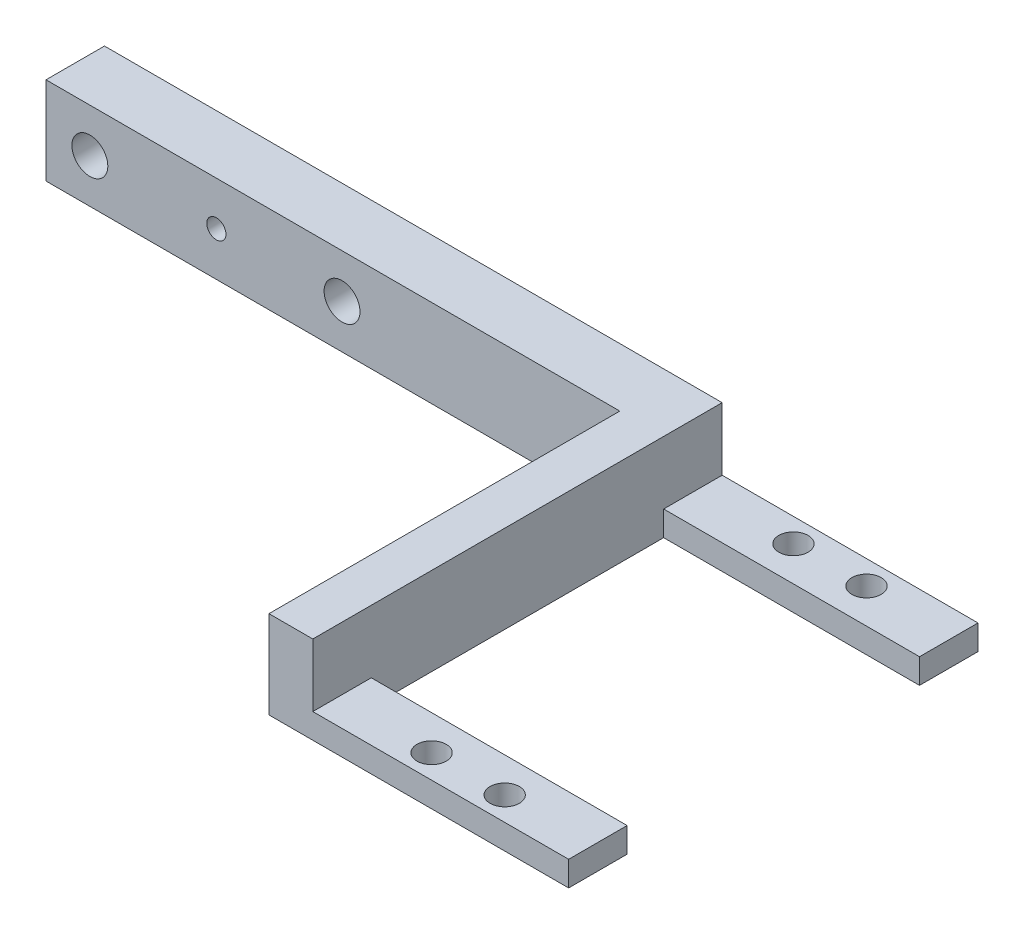
ISO-10303-21;
HEADER;
FILE_DESCRIPTION(('STEP AP214'),'2;1');
FILE_NAME('part.step','',(''),(''),'','','');
FILE_SCHEMA(('AUTOMOTIVE_DESIGN { 1 0 10303 214 1 1 1 1 }'));
ENDSEC;
DATA;
#1=APPLICATION_CONTEXT('core data for automotive mechanical design processes');
#2=APPLICATION_PROTOCOL_DEFINITION('international standard','automotive_design',2000,#1);
#3=PRODUCT_CONTEXT('',#1,'mechanical');
#4=PRODUCT('Part','Part','',(#3));
#5=PRODUCT_RELATED_PRODUCT_CATEGORY('part','',(#4));
#6=PRODUCT_DEFINITION_FORMATION('','',#4);
#7=PRODUCT_DEFINITION_CONTEXT('part definition',#1,'design');
#8=PRODUCT_DEFINITION('design','',#6,#7);
#9=PRODUCT_DEFINITION_SHAPE('','',#8);
#10=(LENGTH_UNIT() NAMED_UNIT(*) SI_UNIT(.MILLI.,.METRE.));
#11=(NAMED_UNIT(*) PLANE_ANGLE_UNIT() SI_UNIT($,.RADIAN.));
#12=(NAMED_UNIT(*) SI_UNIT($,.STERADIAN.) SOLID_ANGLE_UNIT());
#13=UNCERTAINTY_MEASURE_WITH_UNIT(LENGTH_MEASURE(1.E-05),#10,'distance_accuracy_value','');
#14=(GEOMETRIC_REPRESENTATION_CONTEXT(3) GLOBAL_UNCERTAINTY_ASSIGNED_CONTEXT((#13)) GLOBAL_UNIT_ASSIGNED_CONTEXT((#10,
#11,#12)) REPRESENTATION_CONTEXT('',''));
#15=CARTESIAN_POINT('',(0.,0.,0.));
#16=DIRECTION('',(0.,0.,1.));
#17=DIRECTION('',(1.,0.,0.));
#18=AXIS2_PLACEMENT_3D('',#15,#16,#17);
#19=CARTESIAN_POINT('',(59.6891736878179,13.6210934586377,7.99999999999999));
#20=DIRECTION('',(-1.,0.,0.));
#21=DIRECTION('',(0.,-1.,0.));
#22=AXIS2_PLACEMENT_3D('',#19,#20,#21);
#23=PLANE('',#22);
#24=DIRECTION('',(0.,-1.,0.));
#25=VECTOR('',#24,1.);
#26=CARTESIAN_POINT('',(59.6891736878178,1.62109345863774,8.));
#27=LINE('',#26,#25);
#28=CARTESIAN_POINT('',(59.6891736878178,5.02109345863774,8.));
#29=VERTEX_POINT('',#28);
#30=CARTESIAN_POINT('',(59.6891736878178,1.62109345863774,8.));
#31=VERTEX_POINT('',#30);
#32=EDGE_CURVE('E147',#29,#31,#27,.T.);
#33=ORIENTED_EDGE('',*,*,#32,.F.);
#34=DIRECTION('',(0.,0.,1.));
#35=VECTOR('',#34,1.);
#36=CARTESIAN_POINT('',(59.6891736878178,5.02109345863774,0.));
#37=LINE('',#36,#35);
#38=CARTESIAN_POINT('',(59.6891736878178,5.02109345863774,0.));
#39=VERTEX_POINT('',#38);
#40=EDGE_CURVE('E178',#39,#29,#37,.T.);
#41=ORIENTED_EDGE('',*,*,#40,.F.);
#42=DIRECTION('',(0.,1.,0.));
#43=VECTOR('',#42,1.);
#44=CARTESIAN_POINT('',(59.6891736878179,13.6210934586377,0.));
#45=LINE('',#44,#43);
#46=CARTESIAN_POINT('',(59.6891736878179,13.6210934586377,0.));
#47=VERTEX_POINT('',#46);
#48=EDGE_CURVE('E153',#39,#47,#45,.T.);
#49=ORIENTED_EDGE('',*,*,#48,.T.);
#50=DIRECTION('',(0.,0.,-1.));
#51=VECTOR('',#50,1.);
#52=CARTESIAN_POINT('',(59.6891736878179,13.6210934586377,7.99999999999999));
#53=LINE('',#52,#51);
#54=CARTESIAN_POINT('',(59.6891736878179,13.6210934586377,56.));
#55=VERTEX_POINT('',#54);
#56=EDGE_CURVE('E237',#55,#47,#53,.T.);
#57=ORIENTED_EDGE('',*,*,#56,.F.);
#58=DIRECTION('',(0.,1.,0.));
#59=VECTOR('',#58,1.);
#60=CARTESIAN_POINT('',(59.6891736878179,13.6210934586377,56.));
#61=LINE('',#60,#59);
#62=CARTESIAN_POINT('',(59.6891736878178,5.02109345863774,56.));
#63=VERTEX_POINT('',#62);
#64=EDGE_CURVE('E157',#63,#55,#61,.T.);
#65=ORIENTED_EDGE('',*,*,#64,.F.);
#66=DIRECTION('',(0.,0.,1.));
#67=VECTOR('',#66,1.);
#68=CARTESIAN_POINT('',(59.6891736878178,5.02109345863774,48.));
#69=LINE('',#68,#67);
#70=CARTESIAN_POINT('',(59.6891736878178,5.02109345863774,48.));
#71=VERTEX_POINT('',#70);
#72=EDGE_CURVE('E56',#71,#63,#69,.T.);
#73=ORIENTED_EDGE('',*,*,#72,.F.);
#74=DIRECTION('',(0.,1.,0.));
#75=VECTOR('',#74,1.);
#76=CARTESIAN_POINT('',(59.6891736878178,1.62109345863774,48.));
#77=LINE('',#76,#75);
#78=CARTESIAN_POINT('',(59.6891736878178,1.62109345863774,48.));
#79=VERTEX_POINT('',#78);
#80=EDGE_CURVE('E174',#79,#71,#77,.T.);
#81=ORIENTED_EDGE('',*,*,#80,.F.);
#82=DIRECTION('',(0.,0.,-1.));
#83=VECTOR('',#82,1.);
#84=CARTESIAN_POINT('',(59.6891736878178,1.62109345863774,7.99999999999999));
#85=LINE('',#84,#83);
#86=EDGE_CURVE('E48',#79,#31,#85,.T.);
#87=ORIENTED_EDGE('',*,*,#86,.T.);
#88=EDGE_LOOP('',(#33,#41,#49,#57,#65,#73,#81,#87));
#89=FACE_BOUND('',#88,.T.);
#90=ADVANCED_FACE('F39',(#89),#23,.F.);
#91=CARTESIAN_POINT('',(-18.8108263121821,7.62109345863774,7.99999999999999));
#92=DIRECTION('',(0.,0.,-1.));
#93=DIRECTION('',(-1.,0.,0.));
#94=AXIS2_PLACEMENT_3D('',#91,#92,#93);
#95=CYLINDRICAL_SURFACE('',#94,2.45613481493253);
#96=CARTESIAN_POINT('',(-18.8108263121821,7.62109345863774,7.99999999999999));
#97=DIRECTION('',(0.,0.,1.));
#98=DIRECTION('',(1.,0.,0.));
#99=AXIS2_PLACEMENT_3D('',#96,#97,#98);
#100=CIRCLE('',#99,2.45613481493253);
#101=CARTESIAN_POINT('',(-16.3546914972496,7.62109345863774,7.99999999999999));
#102=VERTEX_POINT('',#101);
#103=EDGE_CURVE('E216',#102,#102,#100,.T.);
#104=ORIENTED_EDGE('',*,*,#103,.T.);
#105=EDGE_LOOP('',(#104));
#106=FACE_BOUND('',#105,.T.);
#107=CARTESIAN_POINT('',(-18.8108263121821,7.62109345863774,2.));
#108=DIRECTION('',(0.,0.,-1.));
#109=DIRECTION('',(-1.,0.,0.));
#110=AXIS2_PLACEMENT_3D('',#107,#108,#109);
#111=CIRCLE('',#110,2.45613481493253);
#112=CARTESIAN_POINT('',(-21.2669611271147,7.62109345863774,2.));
#113=VERTEX_POINT('',#112);
#114=EDGE_CURVE('E43',#113,#113,#111,.T.);
#115=ORIENTED_EDGE('',*,*,#114,.T.);
#116=EDGE_LOOP('',(#115));
#117=FACE_BOUND('',#116,.T.);
#118=ADVANCED_FACE('F246',(#106,#117),#95,.F.);
#119=CARTESIAN_POINT('',(15.6891736878179,7.62109345863774,7.99999999999999));
#120=DIRECTION('',(0.,0.,-1.));
#121=DIRECTION('',(-1.,0.,0.));
#122=AXIS2_PLACEMENT_3D('',#119,#120,#121);
#123=CYLINDRICAL_SURFACE('',#122,2.45613481493253);
#124=CARTESIAN_POINT('',(15.6891736878179,7.62109345863774,7.99999999999999));
#125=DIRECTION('',(0.,0.,1.));
#126=DIRECTION('',(1.,0.,0.));
#127=AXIS2_PLACEMENT_3D('',#124,#125,#126);
#128=CIRCLE('',#127,2.45613481493253);
#129=CARTESIAN_POINT('',(18.1453085027504,7.62109345863774,7.99999999999999));
#130=VERTEX_POINT('',#129);
#131=EDGE_CURVE('E213',#130,#130,#128,.T.);
#132=ORIENTED_EDGE('',*,*,#131,.T.);
#133=EDGE_LOOP('',(#132));
#134=FACE_BOUND('',#133,.T.);
#135=CARTESIAN_POINT('',(15.6891736878179,7.62109345863774,2.));
#136=DIRECTION('',(0.,0.,-1.));
#137=DIRECTION('',(-1.,0.,0.));
#138=AXIS2_PLACEMENT_3D('',#135,#136,#137);
#139=CIRCLE('',#138,2.45613481493253);
#140=CARTESIAN_POINT('',(13.2330388728853,7.62109345863774,2.));
#141=VERTEX_POINT('',#140);
#142=EDGE_CURVE('E204',#141,#141,#139,.T.);
#143=ORIENTED_EDGE('',*,*,#142,.T.);
#144=EDGE_LOOP('',(#143));
#145=FACE_BOUND('',#144,.T.);
#146=ADVANCED_FACE('F273',(#134,#145),#123,.F.);
#147=CARTESIAN_POINT('',(0.,0.,7.99999999999999));
#148=DIRECTION('',(0.,0.,1.));
#149=DIRECTION('',(1.,0.,0.));
#150=AXIS2_PLACEMENT_3D('',#147,#148,#149);
#151=PLANE('',#150);
#152=CARTESIAN_POINT('',(-1.50534330558989,7.62109345863774,7.99999999999999));
#153=DIRECTION('',(0.,0.,1.));
#154=DIRECTION('',(1.,0.,0.));
#155=AXIS2_PLACEMENT_3D('',#152,#153,#154);
#156=CIRCLE('',#155,1.31016012446645);
#157=CARTESIAN_POINT('',(-0.195183181123439,7.62109345863774,7.99999999999999));
#158=VERTEX_POINT('',#157);
#159=EDGE_CURVE('E343',#158,#158,#156,.T.);
#160=ORIENTED_EDGE('',*,*,#159,.F.);
#161=EDGE_LOOP('',(#160));
#162=FACE_BOUND('',#161,.T.);
#163=DIRECTION('',(0.,-1.,0.));
#164=VECTOR('',#163,1.);
#165=CARTESIAN_POINT('',(53.6891736878179,13.6210934586377,7.99999999999999));
#166=LINE('',#165,#164);
#167=CARTESIAN_POINT('',(53.6891736878178,13.6210934586377,7.99999999999999));
#168=VERTEX_POINT('',#167);
#169=CARTESIAN_POINT('',(53.6891736878179,1.62109345863774,7.99999999999999));
#170=VERTEX_POINT('',#169);
#171=EDGE_CURVE('E154',#168,#170,#166,.T.);
#172=ORIENTED_EDGE('',*,*,#171,.F.);
#173=DIRECTION('',(-1.,0.,0.));
#174=VECTOR('',#173,1.);
#175=CARTESIAN_POINT('',(-24.8108263121821,13.6210934586377,7.99999999999999));
#176=LINE('',#175,#174);
#177=CARTESIAN_POINT('',(-24.8108263121821,13.6210934586377,7.99999999999999));
#178=VERTEX_POINT('',#177);
#179=EDGE_CURVE('E226',#168,#178,#176,.T.);
#180=ORIENTED_EDGE('',*,*,#179,.T.);
#181=DIRECTION('',(0.,-1.,0.));
#182=VECTOR('',#181,1.);
#183=CARTESIAN_POINT('',(-24.8108263121821,13.6210934586377,7.99999999999999));
#184=LINE('',#183,#182);
#185=CARTESIAN_POINT('',(-24.8108263121821,1.62109345863774,7.99999999999999));
#186=VERTEX_POINT('',#185);
#187=EDGE_CURVE('E220',#178,#186,#184,.T.);
#188=ORIENTED_EDGE('',*,*,#187,.T.);
#189=DIRECTION('',(1.,0.,0.));
#190=VECTOR('',#189,1.);
#191=CARTESIAN_POINT('',(-24.8108263121821,1.62109345863774,7.99999999999999));
#192=LINE('',#191,#190);
#193=EDGE_CURVE('E223',#186,#170,#192,.T.);
#194=ORIENTED_EDGE('',*,*,#193,.T.);
#195=EDGE_LOOP('',(#172,#180,#188,#194));
#196=FACE_BOUND('',#195,.T.);
#197=ORIENTED_EDGE('',*,*,#103,.F.);
#198=EDGE_LOOP('',(#197));
#199=FACE_BOUND('',#198,.T.);
#200=ORIENTED_EDGE('',*,*,#131,.F.);
#201=EDGE_LOOP('',(#200));
#202=FACE_BOUND('',#201,.T.);
#203=ADVANCED_FACE('F263',(#162,#196,#199,#202),#151,.T.);
#204=CARTESIAN_POINT('',(0.,0.,0.));
#205=DIRECTION('',(0.,0.,1.));
#206=DIRECTION('',(1.,0.,0.));
#207=AXIS2_PLACEMENT_3D('',#204,#205,#206);
#208=PLANE('',#207);
#209=CARTESIAN_POINT('',(-1.50534330558989,7.62109345863774,0.));
#210=DIRECTION('',(0.,0.,-1.));
#211=DIRECTION('',(-1.,0.,0.));
#212=AXIS2_PLACEMENT_3D('',#209,#210,#211);
#213=CIRCLE('',#212,1.31016012446645);
#214=CARTESIAN_POINT('',(-2.81550343005635,7.62109345863774,0.));
#215=VERTEX_POINT('',#214);
#216=EDGE_CURVE('E346',#215,#215,#213,.T.);
#217=ORIENTED_EDGE('',*,*,#216,.F.);
#218=EDGE_LOOP('',(#217));
#219=FACE_BOUND('',#218,.T.);
#220=CARTESIAN_POINT('',(15.6891736878179,7.62109345863774,0.));
#221=DIRECTION('',(0.,0.,-1.));
#222=DIRECTION('',(-1.,0.,0.));
#223=AXIS2_PLACEMENT_3D('',#220,#221,#222);
#224=CIRCLE('',#223,3.5);
#225=CARTESIAN_POINT('',(12.1891736878179,7.62109345863774,0.));
#226=VERTEX_POINT('',#225);
#227=EDGE_CURVE('E205',#226,#226,#224,.T.);
#228=ORIENTED_EDGE('',*,*,#227,.F.);
#229=EDGE_LOOP('',(#228));
#230=FACE_BOUND('',#229,.T.);
#231=CARTESIAN_POINT('',(-18.8108263121821,7.62109345863774,0.));
#232=DIRECTION('',(0.,0.,-1.));
#233=DIRECTION('',(-1.,0.,0.));
#234=AXIS2_PLACEMENT_3D('',#231,#232,#233);
#235=CIRCLE('',#234,3.5);
#236=CARTESIAN_POINT('',(-22.3108263121821,7.62109345863774,0.));
#237=VERTEX_POINT('',#236);
#238=EDGE_CURVE('E208',#237,#237,#235,.T.);
#239=ORIENTED_EDGE('',*,*,#238,.F.);
#240=EDGE_LOOP('',(#239));
#241=FACE_BOUND('',#240,.T.);
#242=DIRECTION('',(0.,-1.,0.));
#243=VECTOR('',#242,1.);
#244=CARTESIAN_POINT('',(-24.8108263121821,13.6210934586377,0.));
#245=LINE('',#244,#243);
#246=CARTESIAN_POINT('',(-24.8108263121821,13.6210934586377,0.));
#247=VERTEX_POINT('',#246);
#248=CARTESIAN_POINT('',(-24.8108263121821,1.62109345863774,0.));
#249=VERTEX_POINT('',#248);
#250=EDGE_CURVE('E219',#247,#249,#245,.T.);
#251=ORIENTED_EDGE('',*,*,#250,.F.);
#252=DIRECTION('',(-1.,0.,0.));
#253=VECTOR('',#252,1.);
#254=CARTESIAN_POINT('',(-24.8108263121821,13.6210934586377,0.));
#255=LINE('',#254,#253);
#256=EDGE_CURVE('E224',#47,#247,#255,.T.);
#257=ORIENTED_EDGE('',*,*,#256,.F.);
#258=ORIENTED_EDGE('',*,*,#48,.F.);
#259=DIRECTION('',(-1.,0.,0.));
#260=VECTOR('',#259,1.);
#261=CARTESIAN_POINT('',(94.6891736878178,5.02109345863772,0.));
#262=LINE('',#261,#260);
#263=CARTESIAN_POINT('',(94.6891736878178,5.02109345863772,0.));
#264=VERTEX_POINT('',#263);
#265=EDGE_CURVE('E133',#264,#39,#262,.T.);
#266=ORIENTED_EDGE('',*,*,#265,.F.);
#267=DIRECTION('',(0.,1.,0.));
#268=VECTOR('',#267,1.);
#269=CARTESIAN_POINT('',(94.6891736878178,1.62109345863772,0.));
#270=LINE('',#269,#268);
#271=CARTESIAN_POINT('',(94.6891736878178,1.62109345863772,0.));
#272=VERTEX_POINT('',#271);
#273=EDGE_CURVE('E139',#272,#264,#270,.T.);
#274=ORIENTED_EDGE('',*,*,#273,.F.);
#275=DIRECTION('',(1.,0.,0.));
#276=VECTOR('',#275,1.);
#277=CARTESIAN_POINT('',(-24.8108263121821,1.62109345863774,0.));
#278=LINE('',#277,#276);
#279=EDGE_CURVE('E231',#249,#272,#278,.T.);
#280=ORIENTED_EDGE('',*,*,#279,.F.);
#281=EDGE_LOOP('',(#251,#257,#258,#266,#274,#280));
#282=FACE_BOUND('',#281,.T.);
#283=ADVANCED_FACE('F151',(#219,#230,#241,#282),#208,.F.);
#284=CARTESIAN_POINT('',(-24.8108263121821,13.6210934586377,7.99999999999999));
#285=DIRECTION('',(1.,0.,0.));
#286=DIRECTION('',(0.,1.,0.));
#287=AXIS2_PLACEMENT_3D('',#284,#285,#286);
#288=PLANE('',#287);
#289=ORIENTED_EDGE('',*,*,#250,.T.);
#290=DIRECTION('',(0.,0.,-1.));
#291=VECTOR('',#290,1.);
#292=CARTESIAN_POINT('',(-24.8108263121821,1.62109345863774,7.99999999999999));
#293=LINE('',#292,#291);
#294=EDGE_CURVE('E11',#186,#249,#293,.T.);
#295=ORIENTED_EDGE('',*,*,#294,.F.);
#296=ORIENTED_EDGE('',*,*,#187,.F.);
#297=DIRECTION('',(0.,0.,-1.));
#298=VECTOR('',#297,1.);
#299=CARTESIAN_POINT('',(-24.8108263121821,13.6210934586377,7.99999999999999));
#300=LINE('',#299,#298);
#301=EDGE_CURVE('E228',#178,#247,#300,.T.);
#302=ORIENTED_EDGE('',*,*,#301,.T.);
#303=EDGE_LOOP('',(#289,#295,#296,#302));
#304=FACE_BOUND('',#303,.T.);
#305=ADVANCED_FACE('F41',(#304),#288,.F.);
#306=CARTESIAN_POINT('',(-24.8108263121821,1.62109345863774,7.99999999999999));
#307=DIRECTION('',(0.,1.,0.));
#308=DIRECTION('',(0.,0.,1.));
#309=AXIS2_PLACEMENT_3D('',#306,#307,#308);
#310=PLANE('',#309);
#311=CARTESIAN_POINT('',(82.6891736878178,1.62109345863774,3.25));
#312=DIRECTION('',(0.,1.,0.));
#313=DIRECTION('',(0.,0.,1.));
#314=AXIS2_PLACEMENT_3D('',#311,#312,#313);
#315=CIRCLE('',#314,2.);
#316=CARTESIAN_POINT('',(82.6891736878178,1.62109345863774,5.24999999999999));
#317=VERTEX_POINT('',#316);
#318=EDGE_CURVE('E301',#317,#317,#315,.T.);
#319=ORIENTED_EDGE('',*,*,#318,.T.);
#320=EDGE_LOOP('',(#319));
#321=FACE_BOUND('',#320,.T.);
#322=CARTESIAN_POINT('',(72.6891736878179,1.62109345863774,52.75));
#323=DIRECTION('',(0.,1.,0.));
#324=DIRECTION('',(0.,0.,1.));
#325=AXIS2_PLACEMENT_3D('',#322,#323,#324);
#326=CIRCLE('',#325,2.);
#327=CARTESIAN_POINT('',(72.6891736878179,1.62109345863774,54.75));
#328=VERTEX_POINT('',#327);
#329=EDGE_CURVE('E166',#328,#328,#326,.T.);
#330=ORIENTED_EDGE('',*,*,#329,.T.);
#331=EDGE_LOOP('',(#330));
#332=FACE_BOUND('',#331,.T.);
#333=CARTESIAN_POINT('',(82.6891736878178,1.62109345863774,52.75));
#334=DIRECTION('',(0.,1.,0.));
#335=DIRECTION('',(0.,0.,1.));
#336=AXIS2_PLACEMENT_3D('',#333,#334,#335);
#337=CIRCLE('',#336,2.);
#338=CARTESIAN_POINT('',(82.6891736878178,1.62109345863774,54.75));
#339=VERTEX_POINT('',#338);
#340=EDGE_CURVE('E308',#339,#339,#337,.T.);
#341=ORIENTED_EDGE('',*,*,#340,.T.);
#342=EDGE_LOOP('',(#341));
#343=FACE_BOUND('',#342,.T.);
#344=CARTESIAN_POINT('',(72.6891736878179,1.62109345863774,3.25));
#345=DIRECTION('',(0.,1.,0.));
#346=DIRECTION('',(0.,0.,1.));
#347=AXIS2_PLACEMENT_3D('',#344,#345,#346);
#348=CIRCLE('',#347,2.);
#349=CARTESIAN_POINT('',(72.6891736878179,1.62109345863774,5.24999999999999));
#350=VERTEX_POINT('',#349);
#351=EDGE_CURVE('E312',#350,#350,#348,.T.);
#352=ORIENTED_EDGE('',*,*,#351,.T.);
#353=EDGE_LOOP('',(#352));
#354=FACE_BOUND('',#353,.T.);
#355=ORIENTED_EDGE('',*,*,#279,.T.);
#356=DIRECTION('',(0.,0.,-1.));
#357=VECTOR('',#356,1.);
#358=CARTESIAN_POINT('',(94.6891736878178,1.62109345863772,0.));
#359=LINE('',#358,#357);
#360=CARTESIAN_POINT('',(94.6891736878178,1.62109345863772,8.));
#361=VERTEX_POINT('',#360);
#362=EDGE_CURVE('E145',#361,#272,#359,.T.);
#363=ORIENTED_EDGE('',*,*,#362,.F.);
#364=DIRECTION('',(-1.,0.,0.));
#365=VECTOR('',#364,1.);
#366=CARTESIAN_POINT('',(94.6891736878178,1.62109345863772,8.));
#367=LINE('',#366,#365);
#368=EDGE_CURVE('E159',#361,#31,#367,.T.);
#369=ORIENTED_EDGE('',*,*,#368,.T.);
#370=ORIENTED_EDGE('',*,*,#86,.F.);
#371=DIRECTION('',(-1.,0.,0.));
#372=VECTOR('',#371,1.);
#373=CARTESIAN_POINT('',(94.6891736878178,1.62109345863772,48.));
#374=LINE('',#373,#372);
#375=CARTESIAN_POINT('',(94.6891736878178,1.62109345863772,48.));
#376=VERTEX_POINT('',#375);
#377=EDGE_CURVE('E169',#376,#79,#374,.T.);
#378=ORIENTED_EDGE('',*,*,#377,.F.);
#379=DIRECTION('',(0.,0.,-1.));
#380=VECTOR('',#379,1.);
#381=CARTESIAN_POINT('',(94.6891736878178,1.62109345863772,48.));
#382=LINE('',#381,#380);
#383=CARTESIAN_POINT('',(94.6891736878178,1.62109345863772,56.));
#384=VERTEX_POINT('',#383);
#385=EDGE_CURVE('E172',#384,#376,#382,.T.);
#386=ORIENTED_EDGE('',*,*,#385,.F.);
#387=DIRECTION('',(1.,0.,0.));
#388=VECTOR('',#387,1.);
#389=CARTESIAN_POINT('',(59.6891736878179,1.62109345863774,56.));
#390=LINE('',#389,#388);
#391=CARTESIAN_POINT('',(53.6891736878179,1.62109345863774,56.));
#392=VERTEX_POINT('',#391);
#393=EDGE_CURVE('E192',#392,#384,#390,.T.);
#394=ORIENTED_EDGE('',*,*,#393,.F.);
#395=DIRECTION('',(0.,0.,-1.));
#396=VECTOR('',#395,1.);
#397=CARTESIAN_POINT('',(53.6891736878179,1.62109345863774,56.));
#398=LINE('',#397,#396);
#399=EDGE_CURVE('E193',#392,#170,#398,.T.);
#400=ORIENTED_EDGE('',*,*,#399,.T.);
#401=ORIENTED_EDGE('',*,*,#193,.F.);
#402=ORIENTED_EDGE('',*,*,#294,.T.);
#403=EDGE_LOOP('',(#355,#363,#369,#370,#378,#386,#394,#400,#401,#402));
#404=FACE_BOUND('',#403,.T.);
#405=ADVANCED_FACE('F271',(#321,#332,#343,#354,#404),#310,.F.);
#406=CARTESIAN_POINT('',(-24.8108263121821,13.6210934586377,7.99999999999999));
#407=DIRECTION('',(0.,-1.,0.));
#408=DIRECTION('',(0.,0.,-1.));
#409=AXIS2_PLACEMENT_3D('',#406,#407,#408);
#410=PLANE('',#409);
#411=ORIENTED_EDGE('',*,*,#256,.T.);
#412=ORIENTED_EDGE('',*,*,#301,.F.);
#413=ORIENTED_EDGE('',*,*,#179,.F.);
#414=DIRECTION('',(0.,0.,-1.));
#415=VECTOR('',#414,1.);
#416=CARTESIAN_POINT('',(53.6891736878179,13.6210934586377,56.));
#417=LINE('',#416,#415);
#418=CARTESIAN_POINT('',(53.6891736878179,13.6210934586377,56.));
#419=VERTEX_POINT('',#418);
#420=EDGE_CURVE('E197',#419,#168,#417,.T.);
#421=ORIENTED_EDGE('',*,*,#420,.F.);
#422=DIRECTION('',(-1.,0.,0.));
#423=VECTOR('',#422,1.);
#424=CARTESIAN_POINT('',(59.6891736878179,13.6210934586377,56.));
#425=LINE('',#424,#423);
#426=EDGE_CURVE('E188',#55,#419,#425,.T.);
#427=ORIENTED_EDGE('',*,*,#426,.F.);
#428=ORIENTED_EDGE('',*,*,#56,.T.);
#429=EDGE_LOOP('',(#411,#412,#413,#421,#427,#428));
#430=FACE_BOUND('',#429,.T.);
#431=ADVANCED_FACE('F288',(#430),#410,.F.);
#432=CARTESIAN_POINT('',(15.6891736878179,7.62109345863774,2.));
#433=DIRECTION('',(0.,0.,-1.));
#434=DIRECTION('',(-1.,0.,0.));
#435=AXIS2_PLACEMENT_3D('',#432,#433,#434);
#436=CYLINDRICAL_SURFACE('',#435,3.5);
#437=CARTESIAN_POINT('',(15.6891736878179,7.62109345863774,2.));
#438=DIRECTION('',(0.,0.,-1.));
#439=DIRECTION('',(-1.,0.,0.));
#440=AXIS2_PLACEMENT_3D('',#437,#438,#439);
#441=CIRCLE('',#440,3.5);
#442=CARTESIAN_POINT('',(12.1891736878179,7.62109345863774,2.));
#443=VERTEX_POINT('',#442);
#444=EDGE_CURVE('E201',#443,#443,#441,.T.);
#445=ORIENTED_EDGE('',*,*,#444,.F.);
#446=EDGE_LOOP('',(#445));
#447=FACE_BOUND('',#446,.T.);
#448=ORIENTED_EDGE('',*,*,#227,.T.);
#449=EDGE_LOOP('',(#448));
#450=FACE_BOUND('',#449,.T.);
#451=ADVANCED_FACE('F296',(#447,#450),#436,.F.);
#452=CARTESIAN_POINT('',(15.6891736878179,7.62109345863774,2.));
#453=DIRECTION('',(0.,0.,-1.));
#454=DIRECTION('',(-1.,0.,0.));
#455=AXIS2_PLACEMENT_3D('',#452,#453,#454);
#456=PLANE('',#455);
#457=ORIENTED_EDGE('',*,*,#142,.F.);
#458=EDGE_LOOP('',(#457));
#459=FACE_BOUND('',#458,.T.);
#460=ORIENTED_EDGE('',*,*,#444,.T.);
#461=EDGE_LOOP('',(#460));
#462=FACE_BOUND('',#461,.T.);
#463=ADVANCED_FACE('F258',(#459,#462),#456,.T.);
#464=CARTESIAN_POINT('',(-18.8108263121821,7.62109345863774,2.));
#465=DIRECTION('',(0.,0.,-1.));
#466=DIRECTION('',(-1.,0.,0.));
#467=AXIS2_PLACEMENT_3D('',#464,#465,#466);
#468=CYLINDRICAL_SURFACE('',#467,3.5);
#469=CARTESIAN_POINT('',(-18.8108263121821,7.62109345863774,2.));
#470=DIRECTION('',(0.,0.,-1.));
#471=DIRECTION('',(-1.,0.,0.));
#472=AXIS2_PLACEMENT_3D('',#469,#470,#471);
#473=CIRCLE('',#472,3.5);
#474=CARTESIAN_POINT('',(-22.3108263121821,7.62109345863774,2.));
#475=VERTEX_POINT('',#474);
#476=EDGE_CURVE('E200',#475,#475,#473,.T.);
#477=ORIENTED_EDGE('',*,*,#476,.F.);
#478=EDGE_LOOP('',(#477));
#479=FACE_BOUND('',#478,.T.);
#480=ORIENTED_EDGE('',*,*,#238,.T.);
#481=EDGE_LOOP('',(#480));
#482=FACE_BOUND('',#481,.T.);
#483=ADVANCED_FACE('F252',(#479,#482),#468,.F.);
#484=CARTESIAN_POINT('',(-18.8108263121821,7.62109345863774,2.));
#485=DIRECTION('',(0.,0.,-1.));
#486=DIRECTION('',(-1.,0.,0.));
#487=AXIS2_PLACEMENT_3D('',#484,#485,#486);
#488=PLANE('',#487);
#489=ORIENTED_EDGE('',*,*,#114,.F.);
#490=EDGE_LOOP('',(#489));
#491=FACE_BOUND('',#490,.T.);
#492=ORIENTED_EDGE('',*,*,#476,.T.);
#493=EDGE_LOOP('',(#492));
#494=FACE_BOUND('',#493,.T.);
#495=ADVANCED_FACE('F248',(#491,#494),#488,.T.);
#496=CARTESIAN_POINT('',(53.6891736878179,13.6210934586377,56.));
#497=DIRECTION('',(1.,0.,0.));
#498=DIRECTION('',(0.,0.,-1.));
#499=AXIS2_PLACEMENT_3D('',#496,#497,#498);
#500=PLANE('',#499);
#501=ORIENTED_EDGE('',*,*,#171,.T.);
#502=ORIENTED_EDGE('',*,*,#399,.F.);
#503=DIRECTION('',(0.,-1.,0.));
#504=VECTOR('',#503,1.);
#505=CARTESIAN_POINT('',(53.6891736878179,13.6210934586377,56.));
#506=LINE('',#505,#504);
#507=EDGE_CURVE('E190',#419,#392,#506,.T.);
#508=ORIENTED_EDGE('',*,*,#507,.F.);
#509=ORIENTED_EDGE('',*,*,#420,.T.);
#510=EDGE_LOOP('',(#501,#502,#508,#509));
#511=FACE_BOUND('',#510,.T.);
#512=ADVANCED_FACE('F251',(#511),#500,.F.);
#513=CARTESIAN_POINT('',(0.,0.,56.));
#514=DIRECTION('',(0.,0.,-1.));
#515=DIRECTION('',(-1.,0.,0.));
#516=AXIS2_PLACEMENT_3D('',#513,#514,#515);
#517=PLANE('',#516);
#518=ORIENTED_EDGE('',*,*,#393,.T.);
#519=DIRECTION('',(0.,-1.,0.));
#520=VECTOR('',#519,1.);
#521=CARTESIAN_POINT('',(94.6891736878178,1.62109345863772,56.));
#522=LINE('',#521,#520);
#523=CARTESIAN_POINT('',(94.6891736878178,5.02109345863772,56.));
#524=VERTEX_POINT('',#523);
#525=EDGE_CURVE('E180',#524,#384,#522,.T.);
#526=ORIENTED_EDGE('',*,*,#525,.F.);
#527=DIRECTION('',(-1.,0.,0.));
#528=VECTOR('',#527,1.);
#529=CARTESIAN_POINT('',(94.6891736878178,5.02109345863772,56.));
#530=LINE('',#529,#528);
#531=EDGE_CURVE('E165',#524,#63,#530,.T.);
#532=ORIENTED_EDGE('',*,*,#531,.T.);
#533=ORIENTED_EDGE('',*,*,#64,.T.);
#534=ORIENTED_EDGE('',*,*,#426,.T.);
#535=ORIENTED_EDGE('',*,*,#507,.T.);
#536=EDGE_LOOP('',(#518,#526,#532,#533,#534,#535));
#537=FACE_BOUND('',#536,.T.);
#538=ADVANCED_FACE('F384',(#537),#517,.F.);
#539=CARTESIAN_POINT('',(94.6891736878178,1.62109345863772,48.));
#540=DIRECTION('',(0.,0.,1.));
#541=DIRECTION('',(1.,0.,0.));
#542=AXIS2_PLACEMENT_3D('',#539,#540,#541);
#543=PLANE('',#542);
#544=ORIENTED_EDGE('',*,*,#80,.T.);
#545=DIRECTION('',(-1.,0.,0.));
#546=VECTOR('',#545,1.);
#547=CARTESIAN_POINT('',(94.6891736878178,5.02109345863772,48.));
#548=LINE('',#547,#546);
#549=CARTESIAN_POINT('',(94.6891736878178,5.02109345863772,48.));
#550=VERTEX_POINT('',#549);
#551=EDGE_CURVE('E163',#550,#71,#548,.T.);
#552=ORIENTED_EDGE('',*,*,#551,.F.);
#553=DIRECTION('',(0.,1.,0.));
#554=VECTOR('',#553,1.);
#555=CARTESIAN_POINT('',(94.6891736878178,1.62109345863772,48.));
#556=LINE('',#555,#554);
#557=EDGE_CURVE('E175',#376,#550,#556,.T.);
#558=ORIENTED_EDGE('',*,*,#557,.F.);
#559=ORIENTED_EDGE('',*,*,#377,.T.);
#560=EDGE_LOOP('',(#544,#552,#558,#559));
#561=FACE_BOUND('',#560,.T.);
#562=ADVANCED_FACE('F380',(#561),#543,.F.);
#563=CARTESIAN_POINT('',(94.6891736878178,5.02109345863772,48.));
#564=DIRECTION('',(0.,-1.,0.));
#565=DIRECTION('',(1.,0.,0.));
#566=AXIS2_PLACEMENT_3D('',#563,#564,#565);
#567=PLANE('',#566);
#568=CARTESIAN_POINT('',(72.6891736878179,5.02109345863773,52.75));
#569=DIRECTION('',(0.,1.,0.));
#570=DIRECTION('',(-1.,0.,0.));
#571=AXIS2_PLACEMENT_3D('',#568,#569,#570);
#572=CIRCLE('',#571,2.);
#573=CARTESIAN_POINT('',(70.6891736878179,5.02109345863773,52.75));
#574=VERTEX_POINT('',#573);
#575=EDGE_CURVE('E335',#574,#574,#572,.T.);
#576=ORIENTED_EDGE('',*,*,#575,.F.);
#577=EDGE_LOOP('',(#576));
#578=FACE_BOUND('',#577,.T.);
#579=CARTESIAN_POINT('',(82.6891736878178,5.02109345863772,52.75));
#580=DIRECTION('',(0.,1.,0.));
#581=DIRECTION('',(-1.,0.,0.));
#582=AXIS2_PLACEMENT_3D('',#579,#580,#581);
#583=CIRCLE('',#582,2.);
#584=CARTESIAN_POINT('',(80.6891736878178,5.02109345863772,52.75));
#585=VERTEX_POINT('',#584);
#586=EDGE_CURVE('E338',#585,#585,#583,.T.);
#587=ORIENTED_EDGE('',*,*,#586,.F.);
#588=EDGE_LOOP('',(#587));
#589=FACE_BOUND('',#588,.T.);
#590=ORIENTED_EDGE('',*,*,#72,.T.);
#591=ORIENTED_EDGE('',*,*,#531,.F.);
#592=DIRECTION('',(0.,0.,1.));
#593=VECTOR('',#592,1.);
#594=CARTESIAN_POINT('',(94.6891736878178,5.02109345863772,48.));
#595=LINE('',#594,#593);
#596=EDGE_CURVE('E183',#550,#524,#595,.T.);
#597=ORIENTED_EDGE('',*,*,#596,.F.);
#598=ORIENTED_EDGE('',*,*,#551,.T.);
#599=EDGE_LOOP('',(#590,#591,#597,#598));
#600=FACE_BOUND('',#599,.T.);
#601=ADVANCED_FACE('F383',(#578,#589,#600),#567,.F.);
#602=CARTESIAN_POINT('',(94.6891736878178,0.,0.));
#603=DIRECTION('',(1.,0.,0.));
#604=DIRECTION('',(0.,0.,-1.));
#605=AXIS2_PLACEMENT_3D('',#602,#603,#604);
#606=PLANE('',#605);
#607=ORIENTED_EDGE('',*,*,#557,.T.);
#608=ORIENTED_EDGE('',*,*,#596,.T.);
#609=ORIENTED_EDGE('',*,*,#525,.T.);
#610=ORIENTED_EDGE('',*,*,#385,.T.);
#611=EDGE_LOOP('',(#607,#608,#609,#610));
#612=FACE_BOUND('',#611,.T.);
#613=ADVANCED_FACE('F378',(#612),#606,.T.);
#614=CARTESIAN_POINT('',(94.6891736878178,5.02109345863772,0.));
#615=DIRECTION('',(0.,-1.,0.));
#616=DIRECTION('',(1.,0.,0.));
#617=AXIS2_PLACEMENT_3D('',#614,#615,#616);
#618=PLANE('',#617);
#619=CARTESIAN_POINT('',(82.6891736878178,5.02109345863773,3.25));
#620=DIRECTION('',(0.,1.,0.));
#621=DIRECTION('',(-1.,0.,0.));
#622=AXIS2_PLACEMENT_3D('',#619,#620,#621);
#623=CIRCLE('',#622,2.);
#624=CARTESIAN_POINT('',(80.6891736878178,5.02109345863773,3.25));
#625=VERTEX_POINT('',#624);
#626=EDGE_CURVE('E334',#625,#625,#623,.T.);
#627=ORIENTED_EDGE('',*,*,#626,.F.);
#628=EDGE_LOOP('',(#627));
#629=FACE_BOUND('',#628,.T.);
#630=CARTESIAN_POINT('',(72.6891736878179,5.02109345863773,3.25));
#631=DIRECTION('',(0.,1.,0.));
#632=DIRECTION('',(-1.,0.,0.));
#633=AXIS2_PLACEMENT_3D('',#630,#631,#632);
#634=CIRCLE('',#633,2.);
#635=CARTESIAN_POINT('',(70.6891736878179,5.02109345863774,3.25));
#636=VERTEX_POINT('',#635);
#637=EDGE_CURVE('E331',#636,#636,#634,.T.);
#638=ORIENTED_EDGE('',*,*,#637,.F.);
#639=EDGE_LOOP('',(#638));
#640=FACE_BOUND('',#639,.T.);
#641=ORIENTED_EDGE('',*,*,#40,.T.);
#642=DIRECTION('',(-1.,0.,0.));
#643=VECTOR('',#642,1.);
#644=CARTESIAN_POINT('',(94.6891736878178,5.02109345863772,8.));
#645=LINE('',#644,#643);
#646=CARTESIAN_POINT('',(94.6891736878178,5.02109345863772,8.));
#647=VERTEX_POINT('',#646);
#648=EDGE_CURVE('E135',#647,#29,#645,.T.);
#649=ORIENTED_EDGE('',*,*,#648,.F.);
#650=DIRECTION('',(0.,0.,1.));
#651=VECTOR('',#650,1.);
#652=CARTESIAN_POINT('',(94.6891736878178,5.02109345863772,0.));
#653=LINE('',#652,#651);
#654=EDGE_CURVE('E128',#264,#647,#653,.T.);
#655=ORIENTED_EDGE('',*,*,#654,.F.);
#656=ORIENTED_EDGE('',*,*,#265,.T.);
#657=EDGE_LOOP('',(#641,#649,#655,#656));
#658=FACE_BOUND('',#657,.T.);
#659=ADVANCED_FACE('F131',(#629,#640,#658),#618,.F.);
#660=CARTESIAN_POINT('',(94.6891736878178,1.62109345863772,8.));
#661=DIRECTION('',(0.,0.,-1.));
#662=DIRECTION('',(-1.,0.,0.));
#663=AXIS2_PLACEMENT_3D('',#660,#661,#662);
#664=PLANE('',#663);
#665=ORIENTED_EDGE('',*,*,#32,.T.);
#666=ORIENTED_EDGE('',*,*,#368,.F.);
#667=DIRECTION('',(0.,-1.,0.));
#668=VECTOR('',#667,1.);
#669=CARTESIAN_POINT('',(94.6891736878178,1.62109345863772,8.));
#670=LINE('',#669,#668);
#671=EDGE_CURVE('E138',#647,#361,#670,.T.);
#672=ORIENTED_EDGE('',*,*,#671,.F.);
#673=ORIENTED_EDGE('',*,*,#648,.T.);
#674=EDGE_LOOP('',(#665,#666,#672,#673));
#675=FACE_BOUND('',#674,.T.);
#676=ADVANCED_FACE('F372',(#675),#664,.F.);
#677=CARTESIAN_POINT('',(94.6891736878178,0.,0.));
#678=DIRECTION('',(1.,0.,0.));
#679=DIRECTION('',(0.,0.,-1.));
#680=AXIS2_PLACEMENT_3D('',#677,#678,#679);
#681=PLANE('',#680);
#682=ORIENTED_EDGE('',*,*,#273,.T.);
#683=ORIENTED_EDGE('',*,*,#654,.T.);
#684=ORIENTED_EDGE('',*,*,#671,.T.);
#685=ORIENTED_EDGE('',*,*,#362,.T.);
#686=EDGE_LOOP('',(#682,#683,#684,#685));
#687=FACE_BOUND('',#686,.T.);
#688=ADVANCED_FACE('F143',(#687),#681,.T.);
#689=CARTESIAN_POINT('',(72.6891736878178,-29.9789065413623,3.24999999999999));
#690=DIRECTION('',(0.,1.,0.));
#691=DIRECTION('',(-1.,0.,0.));
#692=AXIS2_PLACEMENT_3D('',#689,#690,#691);
#693=CYLINDRICAL_SURFACE('',#692,2.);
#694=ORIENTED_EDGE('',*,*,#637,.T.);
#695=EDGE_LOOP('',(#694));
#696=FACE_BOUND('',#695,.T.);
#697=ORIENTED_EDGE('',*,*,#351,.F.);
#698=EDGE_LOOP('',(#697));
#699=FACE_BOUND('',#698,.T.);
#700=ADVANCED_FACE('F365',(#696,#699),#693,.F.);
#701=CARTESIAN_POINT('',(82.6891736878178,-29.9789065413623,3.24999999999999));
#702=DIRECTION('',(0.,1.,0.));
#703=DIRECTION('',(-1.,0.,0.));
#704=AXIS2_PLACEMENT_3D('',#701,#702,#703);
#705=CYLINDRICAL_SURFACE('',#704,2.);
#706=ORIENTED_EDGE('',*,*,#626,.T.);
#707=EDGE_LOOP('',(#706));
#708=FACE_BOUND('',#707,.T.);
#709=ORIENTED_EDGE('',*,*,#318,.F.);
#710=EDGE_LOOP('',(#709));
#711=FACE_BOUND('',#710,.T.);
#712=ADVANCED_FACE('F362',(#708,#711),#705,.F.);
#713=CARTESIAN_POINT('',(82.6891736878178,-29.9789065413623,52.75));
#714=DIRECTION('',(0.,1.,0.));
#715=DIRECTION('',(-1.,0.,0.));
#716=AXIS2_PLACEMENT_3D('',#713,#714,#715);
#717=CYLINDRICAL_SURFACE('',#716,2.);
#718=ORIENTED_EDGE('',*,*,#586,.T.);
#719=EDGE_LOOP('',(#718));
#720=FACE_BOUND('',#719,.T.);
#721=ORIENTED_EDGE('',*,*,#340,.F.);
#722=EDGE_LOOP('',(#721));
#723=FACE_BOUND('',#722,.T.);
#724=ADVANCED_FACE('F356',(#720,#723),#717,.F.);
#725=CARTESIAN_POINT('',(72.6891736878178,-29.9789065413623,52.75));
#726=DIRECTION('',(0.,1.,0.));
#727=DIRECTION('',(-1.,0.,0.));
#728=AXIS2_PLACEMENT_3D('',#725,#726,#727);
#729=CYLINDRICAL_SURFACE('',#728,2.);
#730=ORIENTED_EDGE('',*,*,#575,.T.);
#731=EDGE_LOOP('',(#730));
#732=FACE_BOUND('',#731,.T.);
#733=ORIENTED_EDGE('',*,*,#329,.F.);
#734=EDGE_LOOP('',(#733));
#735=FACE_BOUND('',#734,.T.);
#736=ADVANCED_FACE('F350',(#732,#735),#729,.F.);
#737=CARTESIAN_POINT('',(-1.50534330558989,7.62109345863774,10.));
#738=DIRECTION('',(0.,0.,-1.));
#739=DIRECTION('',(-1.,0.,0.));
#740=AXIS2_PLACEMENT_3D('',#737,#738,#739);
#741=CYLINDRICAL_SURFACE('',#740,1.31016012446645);
#742=ORIENTED_EDGE('',*,*,#159,.T.);
#743=EDGE_LOOP('',(#742));
#744=FACE_BOUND('',#743,.T.);
#745=ORIENTED_EDGE('',*,*,#216,.T.);
#746=EDGE_LOOP('',(#745));
#747=FACE_BOUND('',#746,.T.);
#748=ADVANCED_FACE('F349',(#744,#747),#741,.F.);
#749=CLOSED_SHELL('',(#90,#118,#146,#203,#283,#305,#405,#431,#451,#463,#483,#495,#512,#538,#562,
#601,#613,#659,#676,#688,#700,#712,#724,#736,#748));
#750=MANIFOLD_SOLID_BREP('B2',#749);
#751=ADVANCED_BREP_SHAPE_REPRESENTATION('',(#18,#750),#14);
#752=SHAPE_DEFINITION_REPRESENTATION(#9,#751);
ENDSEC;
END-ISO-10303-21;
